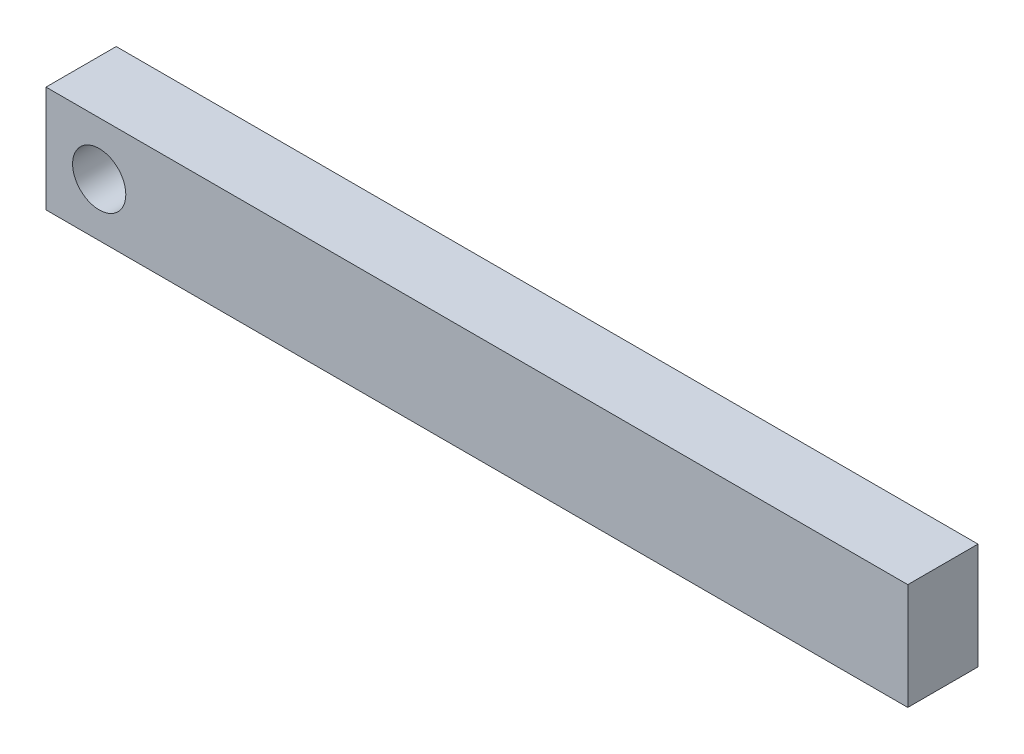
ISO-10303-21;
HEADER;
FILE_DESCRIPTION(('STEP AP214'),'2;1');
FILE_NAME('part.step','',(''),(''),'','','');
FILE_SCHEMA(('AUTOMOTIVE_DESIGN { 1 0 10303 214 1 1 1 1 }'));
ENDSEC;
DATA;
#1=APPLICATION_CONTEXT('core data for automotive mechanical design processes');
#2=APPLICATION_PROTOCOL_DEFINITION('international standard','automotive_design',2000,#1);
#3=PRODUCT_CONTEXT('',#1,'mechanical');
#4=PRODUCT('Part','Part','',(#3));
#5=PRODUCT_RELATED_PRODUCT_CATEGORY('part','',(#4));
#6=PRODUCT_DEFINITION_FORMATION('','',#4);
#7=PRODUCT_DEFINITION_CONTEXT('part definition',#1,'design');
#8=PRODUCT_DEFINITION('design','',#6,#7);
#9=PRODUCT_DEFINITION_SHAPE('','',#8);
#10=(LENGTH_UNIT() NAMED_UNIT(*) SI_UNIT(.MILLI.,.METRE.));
#11=(NAMED_UNIT(*) PLANE_ANGLE_UNIT() SI_UNIT($,.RADIAN.));
#12=(NAMED_UNIT(*) SI_UNIT($,.STERADIAN.) SOLID_ANGLE_UNIT());
#13=UNCERTAINTY_MEASURE_WITH_UNIT(LENGTH_MEASURE(1.E-05),#10,'distance_accuracy_value','');
#14=(GEOMETRIC_REPRESENTATION_CONTEXT(3) GLOBAL_UNCERTAINTY_ASSIGNED_CONTEXT((#13)) GLOBAL_UNIT_ASSIGNED_CONTEXT((#10,
#11,#12)) REPRESENTATION_CONTEXT('',''));
#15=CARTESIAN_POINT('',(0.,0.,0.));
#16=DIRECTION('',(0.,0.,1.));
#17=DIRECTION('',(1.,0.,0.));
#18=AXIS2_PLACEMENT_3D('',#15,#16,#17);
#19=CARTESIAN_POINT('',(0.,0.,3.3));
#20=DIRECTION('',(0.,0.,1.));
#21=DIRECTION('',(1.,0.,0.));
#22=AXIS2_PLACEMENT_3D('',#19,#20,#21);
#23=PLANE('',#22);
#24=DIRECTION('',(0.,-1.,0.));
#25=VECTOR('',#24,1.);
#26=CARTESIAN_POINT('',(-2.5,2.5,3.3));
#27=LINE('',#26,#25);
#28=CARTESIAN_POINT('',(-2.5,2.5,3.3));
#29=VERTEX_POINT('',#28);
#30=CARTESIAN_POINT('',(-2.5,-2.5,3.3));
#31=VERTEX_POINT('',#30);
#32=EDGE_CURVE('E94',#29,#31,#27,.T.);
#33=ORIENTED_EDGE('',*,*,#32,.T.);
#34=DIRECTION('',(1.,0.,0.));
#35=VECTOR('',#34,1.);
#36=CARTESIAN_POINT('',(-2.5,-2.5,3.3));
#37=LINE('',#36,#35);
#38=CARTESIAN_POINT('',(38.,-2.5,3.3));
#39=VERTEX_POINT('',#38);
#40=EDGE_CURVE('E89',#31,#39,#37,.T.);
#41=ORIENTED_EDGE('',*,*,#40,.T.);
#42=DIRECTION('',(0.,1.,0.));
#43=VECTOR('',#42,1.);
#44=CARTESIAN_POINT('',(38.,2.5,3.3));
#45=LINE('',#44,#43);
#46=CARTESIAN_POINT('',(38.,2.5,3.3));
#47=VERTEX_POINT('',#46);
#48=EDGE_CURVE('E92',#39,#47,#45,.T.);
#49=ORIENTED_EDGE('',*,*,#48,.T.);
#50=DIRECTION('',(-1.,0.,0.));
#51=VECTOR('',#50,1.);
#52=CARTESIAN_POINT('',(-2.5,2.5,3.3));
#53=LINE('',#52,#51);
#54=EDGE_CURVE('E59',#47,#29,#53,.T.);
#55=ORIENTED_EDGE('',*,*,#54,.T.);
#56=EDGE_LOOP('',(#33,#41,#49,#55));
#57=FACE_BOUND('',#56,.T.);
#58=CARTESIAN_POINT('',(0.,0.,3.3));
#59=DIRECTION('',(0.,0.,1.));
#60=DIRECTION('',(1.,0.,0.));
#61=AXIS2_PLACEMENT_3D('',#58,#59,#60);
#62=CIRCLE('',#61,1.25);
#63=CARTESIAN_POINT('',(1.25,0.,3.3));
#64=VERTEX_POINT('',#63);
#65=EDGE_CURVE('E114',#64,#64,#62,.T.);
#66=ORIENTED_EDGE('',*,*,#65,.F.);
#67=EDGE_LOOP('',(#66));
#68=FACE_BOUND('',#67,.T.);
#69=ADVANCED_FACE('F41',(#57,#68),#23,.T.);
#70=CARTESIAN_POINT('',(0.,0.,0.));
#71=DIRECTION('',(0.,0.,1.));
#72=DIRECTION('',(1.,0.,0.));
#73=AXIS2_PLACEMENT_3D('',#70,#71,#72);
#74=PLANE('',#73);
#75=DIRECTION('',(0.,-1.,0.));
#76=VECTOR('',#75,1.);
#77=CARTESIAN_POINT('',(-2.5,2.5,0.));
#78=LINE('',#77,#76);
#79=CARTESIAN_POINT('',(-2.5,2.5,0.));
#80=VERTEX_POINT('',#79);
#81=CARTESIAN_POINT('',(-2.5,-2.5,0.));
#82=VERTEX_POINT('',#81);
#83=EDGE_CURVE('E110',#80,#82,#78,.T.);
#84=ORIENTED_EDGE('',*,*,#83,.F.);
#85=DIRECTION('',(-1.,0.,0.));
#86=VECTOR('',#85,1.);
#87=CARTESIAN_POINT('',(-2.5,2.5,0.));
#88=LINE('',#87,#86);
#89=CARTESIAN_POINT('',(38.,2.5,0.));
#90=VERTEX_POINT('',#89);
#91=EDGE_CURVE('E82',#90,#80,#88,.T.);
#92=ORIENTED_EDGE('',*,*,#91,.F.);
#93=DIRECTION('',(0.,1.,0.));
#94=VECTOR('',#93,1.);
#95=CARTESIAN_POINT('',(38.,2.5,0.));
#96=LINE('',#95,#94);
#97=CARTESIAN_POINT('',(38.,-2.5,0.));
#98=VERTEX_POINT('',#97);
#99=EDGE_CURVE('E76',#98,#90,#96,.T.);
#100=ORIENTED_EDGE('',*,*,#99,.F.);
#101=DIRECTION('',(1.,0.,0.));
#102=VECTOR('',#101,1.);
#103=CARTESIAN_POINT('',(-2.5,-2.5,0.));
#104=LINE('',#103,#102);
#105=EDGE_CURVE('E99',#82,#98,#104,.T.);
#106=ORIENTED_EDGE('',*,*,#105,.F.);
#107=EDGE_LOOP('',(#84,#92,#100,#106));
#108=FACE_BOUND('',#107,.T.);
#109=CARTESIAN_POINT('',(0.,0.,0.));
#110=DIRECTION('',(0.,0.,1.));
#111=DIRECTION('',(1.,0.,0.));
#112=AXIS2_PLACEMENT_3D('',#109,#110,#111);
#113=CIRCLE('',#112,1.25);
#114=CARTESIAN_POINT('',(1.25,0.,0.));
#115=VERTEX_POINT('',#114);
#116=EDGE_CURVE('E132',#115,#115,#113,.T.);
#117=ORIENTED_EDGE('',*,*,#116,.T.);
#118=EDGE_LOOP('',(#117));
#119=FACE_BOUND('',#118,.T.);
#120=ADVANCED_FACE('F127',(#108,#119),#74,.F.);
#121=CARTESIAN_POINT('',(-2.5,2.5,3.3));
#122=DIRECTION('',(1.,0.,0.));
#123=DIRECTION('',(0.,1.,0.));
#124=AXIS2_PLACEMENT_3D('',#121,#122,#123);
#125=PLANE('',#124);
#126=ORIENTED_EDGE('',*,*,#83,.T.);
#127=DIRECTION('',(0.,0.,-1.));
#128=VECTOR('',#127,1.);
#129=CARTESIAN_POINT('',(-2.5,-2.5,3.3));
#130=LINE('',#129,#128);
#131=EDGE_CURVE('E11',#31,#82,#130,.T.);
#132=ORIENTED_EDGE('',*,*,#131,.F.);
#133=ORIENTED_EDGE('',*,*,#32,.F.);
#134=DIRECTION('',(0.,0.,-1.));
#135=VECTOR('',#134,1.);
#136=CARTESIAN_POINT('',(-2.5,2.5,3.3));
#137=LINE('',#136,#135);
#138=EDGE_CURVE('E106',#29,#80,#137,.T.);
#139=ORIENTED_EDGE('',*,*,#138,.T.);
#140=EDGE_LOOP('',(#126,#132,#133,#139));
#141=FACE_BOUND('',#140,.T.);
#142=ADVANCED_FACE('F43',(#141),#125,.F.);
#143=CARTESIAN_POINT('',(-2.5,-2.5,3.3));
#144=DIRECTION('',(0.,1.,0.));
#145=DIRECTION('',(0.,0.,1.));
#146=AXIS2_PLACEMENT_3D('',#143,#144,#145);
#147=PLANE('',#146);
#148=ORIENTED_EDGE('',*,*,#105,.T.);
#149=DIRECTION('',(0.,0.,-1.));
#150=VECTOR('',#149,1.);
#151=CARTESIAN_POINT('',(38.,-2.5,3.3));
#152=LINE('',#151,#150);
#153=EDGE_CURVE('E51',#39,#98,#152,.T.);
#154=ORIENTED_EDGE('',*,*,#153,.F.);
#155=ORIENTED_EDGE('',*,*,#40,.F.);
#156=ORIENTED_EDGE('',*,*,#131,.T.);
#157=EDGE_LOOP('',(#148,#154,#155,#156));
#158=FACE_BOUND('',#157,.T.);
#159=ADVANCED_FACE('F98',(#158),#147,.F.);
#160=CARTESIAN_POINT('',(38.,2.5,3.3));
#161=DIRECTION('',(-1.,0.,0.));
#162=DIRECTION('',(0.,0.,1.));
#163=AXIS2_PLACEMENT_3D('',#160,#161,#162);
#164=PLANE('',#163);
#165=ORIENTED_EDGE('',*,*,#99,.T.);
#166=DIRECTION('',(0.,0.,-1.));
#167=VECTOR('',#166,1.);
#168=CARTESIAN_POINT('',(38.,2.5,3.3));
#169=LINE('',#168,#167);
#170=EDGE_CURVE('E101',#47,#90,#169,.T.);
#171=ORIENTED_EDGE('',*,*,#170,.F.);
#172=ORIENTED_EDGE('',*,*,#48,.F.);
#173=ORIENTED_EDGE('',*,*,#153,.T.);
#174=EDGE_LOOP('',(#165,#171,#172,#173));
#175=FACE_BOUND('',#174,.T.);
#176=ADVANCED_FACE('F102',(#175),#164,.F.);
#177=CARTESIAN_POINT('',(-2.5,2.5,3.3));
#178=DIRECTION('',(0.,-1.,0.));
#179=DIRECTION('',(0.,0.,-1.));
#180=AXIS2_PLACEMENT_3D('',#177,#178,#179);
#181=PLANE('',#180);
#182=ORIENTED_EDGE('',*,*,#91,.T.);
#183=ORIENTED_EDGE('',*,*,#138,.F.);
#184=ORIENTED_EDGE('',*,*,#54,.F.);
#185=ORIENTED_EDGE('',*,*,#170,.T.);
#186=EDGE_LOOP('',(#182,#183,#184,#185));
#187=FACE_BOUND('',#186,.T.);
#188=ADVANCED_FACE('F124',(#187),#181,.F.);
#189=CARTESIAN_POINT('',(0.,0.,3.3));
#190=DIRECTION('',(0.,0.,-1.));
#191=DIRECTION('',(-1.,0.,0.));
#192=AXIS2_PLACEMENT_3D('',#189,#190,#191);
#193=CYLINDRICAL_SURFACE('',#192,1.25);
#194=ORIENTED_EDGE('',*,*,#65,.T.);
#195=EDGE_LOOP('',(#194));
#196=FACE_BOUND('',#195,.T.);
#197=ORIENTED_EDGE('',*,*,#116,.F.);
#198=EDGE_LOOP('',(#197));
#199=FACE_BOUND('',#198,.T.);
#200=ADVANCED_FACE('F140',(#196,#199),#193,.F.);
#201=CLOSED_SHELL('',(#69,#120,#142,#159,#176,#188,#200));
#202=MANIFOLD_SOLID_BREP('B2',#201);
#203=ADVANCED_BREP_SHAPE_REPRESENTATION('',(#18,#202),#14);
#204=SHAPE_DEFINITION_REPRESENTATION(#9,#203);
ENDSEC;
END-ISO-10303-21;
